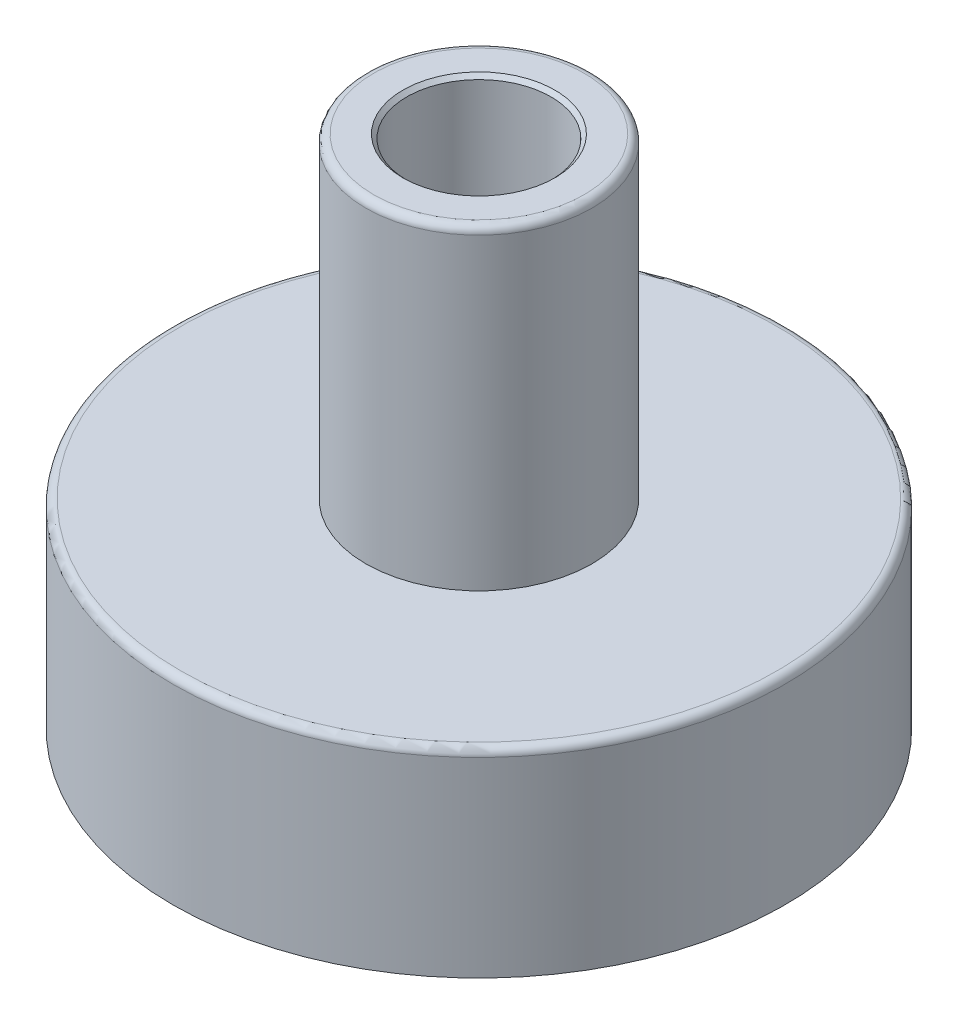
ISO-10303-21;
HEADER;
FILE_DESCRIPTION(('STEP AP214'),'2;1');
FILE_NAME('part.step','',(''),(''),'','','');
FILE_SCHEMA(('AUTOMOTIVE_DESIGN { 1 0 10303 214 1 1 1 1 }'));
ENDSEC;
DATA;
#1=APPLICATION_CONTEXT('core data for automotive mechanical design processes');
#2=APPLICATION_PROTOCOL_DEFINITION('international standard','automotive_design',2000,#1);
#3=PRODUCT_CONTEXT('',#1,'mechanical');
#4=PRODUCT('Part','Part','',(#3));
#5=PRODUCT_RELATED_PRODUCT_CATEGORY('part','',(#4));
#6=PRODUCT_DEFINITION_FORMATION('','',#4);
#7=PRODUCT_DEFINITION_CONTEXT('part definition',#1,'design');
#8=PRODUCT_DEFINITION('design','',#6,#7);
#9=PRODUCT_DEFINITION_SHAPE('','',#8);
#10=(LENGTH_UNIT() NAMED_UNIT(*) SI_UNIT(.MILLI.,.METRE.));
#11=(NAMED_UNIT(*) PLANE_ANGLE_UNIT() SI_UNIT($,.RADIAN.));
#12=(NAMED_UNIT(*) SI_UNIT($,.STERADIAN.) SOLID_ANGLE_UNIT());
#13=UNCERTAINTY_MEASURE_WITH_UNIT(LENGTH_MEASURE(1.E-05),#10,'distance_accuracy_value','');
#14=(GEOMETRIC_REPRESENTATION_CONTEXT(3) GLOBAL_UNCERTAINTY_ASSIGNED_CONTEXT((#13)) GLOBAL_UNIT_ASSIGNED_CONTEXT((#10,
#11,#12)) REPRESENTATION_CONTEXT('',''));
#15=CARTESIAN_POINT('',(0.,0.,0.));
#16=DIRECTION('',(0.,0.,1.));
#17=DIRECTION('',(1.,0.,0.));
#18=AXIS2_PLACEMENT_3D('',#15,#16,#17);
#19=CARTESIAN_POINT('',(0.,-5.1,0.));
#20=DIRECTION('',(0.,1.,0.));
#21=DIRECTION('',(0.,0.,1.));
#22=AXIS2_PLACEMENT_3D('',#19,#20,#21);
#23=CYLINDRICAL_SURFACE('',#22,7.85);
#24=CARTESIAN_POINT('',(0.,-0.2,0.));
#25=DIRECTION('',(0.,1.,0.));
#26=DIRECTION('',(0.,0.,1.));
#27=AXIS2_PLACEMENT_3D('',#24,#25,#26);
#28=CIRCLE('',#27,7.85);
#29=CARTESIAN_POINT('',(0.,-0.2,7.85));
#30=VERTEX_POINT('',#29);
#31=EDGE_CURVE('E10',#30,#30,#28,.F.);
#32=ORIENTED_EDGE('',*,*,#31,.T.);
#33=EDGE_LOOP('',(#32));
#34=FACE_BOUND('',#33,.T.);
#35=CARTESIAN_POINT('',(0.,-5.1,0.));
#36=DIRECTION('',(0.,1.,0.));
#37=DIRECTION('',(0.,0.,1.));
#38=AXIS2_PLACEMENT_3D('',#35,#36,#37);
#39=CIRCLE('',#38,7.85);
#40=CARTESIAN_POINT('',(0.,-5.1,7.85));
#41=VERTEX_POINT('',#40);
#42=EDGE_CURVE('E72',#41,#41,#39,.T.);
#43=ORIENTED_EDGE('',*,*,#42,.T.);
#44=EDGE_LOOP('',(#43));
#45=FACE_BOUND('',#44,.T.);
#46=ADVANCED_FACE('F39',(#34,#45),#23,.T.);
#47=CARTESIAN_POINT('',(0.,-5.1,0.));
#48=DIRECTION('',(0.,1.,0.));
#49=DIRECTION('',(0.,0.,1.));
#50=AXIS2_PLACEMENT_3D('',#47,#48,#49);
#51=PLANE('',#50);
#52=CARTESIAN_POINT('',(0.,-5.1,0.));
#53=DIRECTION('',(0.,-1.,0.));
#54=DIRECTION('',(0.,0.,-1.));
#55=AXIS2_PLACEMENT_3D('',#52,#53,#54);
#56=CIRCLE('',#55,6.25);
#57=CARTESIAN_POINT('',(0.,-5.1,-6.25));
#58=VERTEX_POINT('',#57);
#59=EDGE_CURVE('E84',#58,#58,#56,.T.);
#60=ORIENTED_EDGE('',*,*,#59,.F.);
#61=EDGE_LOOP('',(#60));
#62=FACE_BOUND('',#61,.T.);
#63=ORIENTED_EDGE('',*,*,#42,.F.);
#64=EDGE_LOOP('',(#63));
#65=FACE_BOUND('',#64,.T.);
#66=ADVANCED_FACE('F115',(#62,#65),#51,.F.);
#67=CARTESIAN_POINT('',(0.,0.,0.));
#68=DIRECTION('',(0.,1.,0.));
#69=DIRECTION('',(0.,0.,1.));
#70=AXIS2_PLACEMENT_3D('',#67,#68,#69);
#71=PLANE('',#70);
#72=CARTESIAN_POINT('',(0.,0.,0.));
#73=DIRECTION('',(0.,1.,0.));
#74=DIRECTION('',(0.,0.,1.));
#75=AXIS2_PLACEMENT_3D('',#72,#73,#74);
#76=CIRCLE('',#75,7.65);
#77=CARTESIAN_POINT('',(0.,0.,7.65));
#78=VERTEX_POINT('',#77);
#79=EDGE_CURVE('E47',#78,#78,#76,.T.);
#80=ORIENTED_EDGE('',*,*,#79,.T.);
#81=EDGE_LOOP('',(#80));
#82=FACE_BOUND('',#81,.T.);
#83=CARTESIAN_POINT('',(0.,0.,0.));
#84=DIRECTION('',(0.,1.,0.));
#85=DIRECTION('',(0.,0.,1.));
#86=AXIS2_PLACEMENT_3D('',#83,#84,#85);
#87=CIRCLE('',#86,2.9);
#88=CARTESIAN_POINT('',(0.,0.,2.9));
#89=VERTEX_POINT('',#88);
#90=EDGE_CURVE('E71',#89,#89,#87,.T.);
#91=ORIENTED_EDGE('',*,*,#90,.F.);
#92=EDGE_LOOP('',(#91));
#93=FACE_BOUND('',#92,.T.);
#94=ADVANCED_FACE('F118',(#82,#93),#71,.T.);
#95=CARTESIAN_POINT('',(0.,8.1,0.));
#96=DIRECTION('',(0.,-1.,0.));
#97=DIRECTION('',(0.,0.,-1.));
#98=AXIS2_PLACEMENT_3D('',#95,#96,#97);
#99=CYLINDRICAL_SURFACE('',#98,2.9);
#100=CARTESIAN_POINT('',(0.,7.9,0.));
#101=DIRECTION('',(0.,1.,0.));
#102=DIRECTION('',(0.,0.,1.));
#103=AXIS2_PLACEMENT_3D('',#100,#101,#102);
#104=CIRCLE('',#103,2.9);
#105=CARTESIAN_POINT('',(0.,7.9,2.9));
#106=VERTEX_POINT('',#105);
#107=EDGE_CURVE('E52',#106,#106,#104,.F.);
#108=ORIENTED_EDGE('',*,*,#107,.T.);
#109=EDGE_LOOP('',(#108));
#110=FACE_BOUND('',#109,.T.);
#111=ORIENTED_EDGE('',*,*,#90,.T.);
#112=EDGE_LOOP('',(#111));
#113=FACE_BOUND('',#112,.T.);
#114=ADVANCED_FACE('F151',(#110,#113),#99,.T.);
#115=CARTESIAN_POINT('',(0.,8.1,0.));
#116=DIRECTION('',(0.,1.,0.));
#117=DIRECTION('',(0.,0.,1.));
#118=AXIS2_PLACEMENT_3D('',#115,#116,#117);
#119=PLANE('',#118);
#120=CARTESIAN_POINT('',(0.,8.1,0.));
#121=DIRECTION('',(0.,1.,0.));
#122=DIRECTION('',(0.,0.,1.));
#123=AXIS2_PLACEMENT_3D('',#120,#121,#122);
#124=CIRCLE('',#123,2.7);
#125=CARTESIAN_POINT('',(0.,8.1,2.7));
#126=VERTEX_POINT('',#125);
#127=EDGE_CURVE('E57',#126,#126,#124,.T.);
#128=ORIENTED_EDGE('',*,*,#127,.T.);
#129=EDGE_LOOP('',(#128));
#130=FACE_BOUND('',#129,.T.);
#131=CARTESIAN_POINT('',(0.,8.1,0.));
#132=DIRECTION('',(0.,1.,0.));
#133=DIRECTION('',(0.,0.,1.));
#134=AXIS2_PLACEMENT_3D('',#131,#132,#133);
#135=CIRCLE('',#134,1.95);
#136=CARTESIAN_POINT('',(0.,8.1,1.95));
#137=VERTEX_POINT('',#136);
#138=EDGE_CURVE('E63',#137,#137,#135,.F.);
#139=ORIENTED_EDGE('',*,*,#138,.T.);
#140=EDGE_LOOP('',(#139));
#141=FACE_BOUND('',#140,.T.);
#142=ADVANCED_FACE('F147',(#130,#141),#119,.T.);
#143=CARTESIAN_POINT('',(0.,1.1,0.));
#144=DIRECTION('',(0.,1.,0.));
#145=DIRECTION('',(0.,0.,1.));
#146=AXIS2_PLACEMENT_3D('',#143,#144,#145);
#147=CYLINDRICAL_SURFACE('',#146,1.85);
#148=CARTESIAN_POINT('',(0.,8.,0.));
#149=DIRECTION('',(0.,1.,0.));
#150=DIRECTION('',(0.,0.,1.));
#151=AXIS2_PLACEMENT_3D('',#148,#149,#150);
#152=CIRCLE('',#151,1.85);
#153=CARTESIAN_POINT('',(0.,8.,1.85));
#154=VERTEX_POINT('',#153);
#155=EDGE_CURVE('E67',#154,#154,#152,.T.);
#156=ORIENTED_EDGE('',*,*,#155,.T.);
#157=EDGE_LOOP('',(#156));
#158=FACE_BOUND('',#157,.T.);
#159=CARTESIAN_POINT('',(0.,1.1,0.));
#160=DIRECTION('',(0.,1.,0.));
#161=DIRECTION('',(0.,0.,1.));
#162=AXIS2_PLACEMENT_3D('',#159,#160,#161);
#163=CIRCLE('',#162,1.85);
#164=CARTESIAN_POINT('',(0.,1.1,1.85));
#165=VERTEX_POINT('',#164);
#166=EDGE_CURVE('E76',#165,#165,#163,.T.);
#167=ORIENTED_EDGE('',*,*,#166,.F.);
#168=EDGE_LOOP('',(#167));
#169=FACE_BOUND('',#168,.T.);
#170=ADVANCED_FACE('F150',(#158,#169),#147,.F.);
#171=CARTESIAN_POINT('',(0.,1.1,0.));
#172=DIRECTION('',(0.,1.,0.));
#173=DIRECTION('',(0.,0.,1.));
#174=AXIS2_PLACEMENT_3D('',#171,#172,#173);
#175=PLANE('',#174);
#176=ORIENTED_EDGE('',*,*,#166,.T.);
#177=EDGE_LOOP('',(#176));
#178=FACE_BOUND('',#177,.T.);
#179=ADVANCED_FACE('F135',(#178),#175,.T.);
#180=CARTESIAN_POINT('',(0.,8.,0.));
#181=DIRECTION('',(0.,1.,0.));
#182=DIRECTION('',(0.,0.,1.));
#183=AXIS2_PLACEMENT_3D('',#180,#181,#182);
#184=CONICAL_SURFACE('',#183,1.85,0.785398163397444);
#185=ORIENTED_EDGE('',*,*,#138,.F.);
#186=EDGE_LOOP('',(#185));
#187=FACE_BOUND('',#186,.T.);
#188=ORIENTED_EDGE('',*,*,#155,.F.);
#189=EDGE_LOOP('',(#188));
#190=FACE_BOUND('',#189,.T.);
#191=ADVANCED_FACE('F130',(#187,#190),#184,.F.);
#192=CARTESIAN_POINT('',(0.,7.9,0.));
#193=DIRECTION('',(0.,1.,0.));
#194=DIRECTION('',(0.,0.,1.));
#195=AXIS2_PLACEMENT_3D('',#192,#193,#194);
#196=TOROIDAL_SURFACE('',#195,2.7,0.2);
#197=ORIENTED_EDGE('',*,*,#107,.F.);
#198=EDGE_LOOP('',(#197));
#199=FACE_BOUND('',#198,.T.);
#200=ORIENTED_EDGE('',*,*,#127,.F.);
#201=EDGE_LOOP('',(#200));
#202=FACE_BOUND('',#201,.T.);
#203=ADVANCED_FACE('F134',(#199,#202),#196,.T.);
#204=CARTESIAN_POINT('',(0.,-0.2,0.));
#205=DIRECTION('',(0.,1.,0.));
#206=DIRECTION('',(0.,0.,1.));
#207=AXIS2_PLACEMENT_3D('',#204,#205,#206);
#208=TOROIDAL_SURFACE('',#207,7.65,0.2);
#209=ORIENTED_EDGE('',*,*,#31,.F.);
#210=EDGE_LOOP('',(#209));
#211=FACE_BOUND('',#210,.T.);
#212=ORIENTED_EDGE('',*,*,#79,.F.);
#213=EDGE_LOOP('',(#212));
#214=FACE_BOUND('',#213,.T.);
#215=ADVANCED_FACE('F41',(#211,#214),#208,.T.);
#216=CARTESIAN_POINT('',(0.,-4.85,0.));
#217=DIRECTION('',(0.,-1.,0.));
#218=DIRECTION('',(0.,0.,-1.));
#219=AXIS2_PLACEMENT_3D('',#216,#217,#218);
#220=CYLINDRICAL_SURFACE('',#219,6.25);
#221=CARTESIAN_POINT('',(0.,-4.85,0.));
#222=DIRECTION('',(0.,-1.,0.));
#223=DIRECTION('',(0.,0.,-1.));
#224=AXIS2_PLACEMENT_3D('',#221,#222,#223);
#225=CIRCLE('',#224,6.25);
#226=CARTESIAN_POINT('',(0.,-4.85,-6.25));
#227=VERTEX_POINT('',#226);
#228=EDGE_CURVE('E83',#227,#227,#225,.T.);
#229=ORIENTED_EDGE('',*,*,#228,.F.);
#230=EDGE_LOOP('',(#229));
#231=FACE_BOUND('',#230,.T.);
#232=ORIENTED_EDGE('',*,*,#59,.T.);
#233=EDGE_LOOP('',(#232));
#234=FACE_BOUND('',#233,.T.);
#235=ADVANCED_FACE('F106',(#231,#234),#220,.F.);
#236=CARTESIAN_POINT('',(0.,-4.85,0.));
#237=DIRECTION('',(0.,-1.,0.));
#238=DIRECTION('',(0.,0.,-1.));
#239=AXIS2_PLACEMENT_3D('',#236,#237,#238);
#240=PLANE('',#239);
#241=CARTESIAN_POINT('',(0.,-4.85,0.));
#242=DIRECTION('',(0.,-1.,0.));
#243=DIRECTION('',(0.,0.,-1.));
#244=AXIS2_PLACEMENT_3D('',#241,#242,#243);
#245=CIRCLE('',#244,6.);
#246=CARTESIAN_POINT('',(0.,-4.85,-6.));
#247=VERTEX_POINT('',#246);
#248=EDGE_CURVE('E88',#247,#247,#245,.T.);
#249=ORIENTED_EDGE('',*,*,#248,.F.);
#250=EDGE_LOOP('',(#249));
#251=FACE_BOUND('',#250,.T.);
#252=ORIENTED_EDGE('',*,*,#228,.T.);
#253=EDGE_LOOP('',(#252));
#254=FACE_BOUND('',#253,.T.);
#255=ADVANCED_FACE('F103',(#251,#254),#240,.T.);
#256=CARTESIAN_POINT('',(0.,-4.85,0.));
#257=DIRECTION('',(0.,-1.,0.));
#258=DIRECTION('',(0.,0.,-1.));
#259=AXIS2_PLACEMENT_3D('',#256,#257,#258);
#260=CYLINDRICAL_SURFACE('',#259,6.);
#261=ORIENTED_EDGE('',*,*,#248,.T.);
#262=EDGE_LOOP('',(#261));
#263=FACE_BOUND('',#262,.T.);
#264=CARTESIAN_POINT('',(0.,-5.1,0.));
#265=DIRECTION('',(0.,-1.,0.));
#266=DIRECTION('',(0.,0.,-1.));
#267=AXIS2_PLACEMENT_3D('',#264,#265,#266);
#268=CIRCLE('',#267,6.);
#269=CARTESIAN_POINT('',(0.,-5.1,-6.));
#270=VERTEX_POINT('',#269);
#271=EDGE_CURVE('E92',#270,#270,#268,.T.);
#272=ORIENTED_EDGE('',*,*,#271,.F.);
#273=EDGE_LOOP('',(#272));
#274=FACE_BOUND('',#273,.T.);
#275=ADVANCED_FACE('F100',(#263,#274),#260,.T.);
#276=ORIENTED_EDGE('',*,*,#271,.T.);
#277=EDGE_LOOP('',(#276));
#278=FACE_BOUND('',#277,.T.);
#279=ADVANCED_FACE('F120',(#278),#51,.F.);
#280=CLOSED_SHELL('',(#46,#66,#94,#114,#142,#170,#179,#191,#203,#215,#235,#255,#275,#279));
#281=MANIFOLD_SOLID_BREP('B2',#280);
#282=ADVANCED_BREP_SHAPE_REPRESENTATION('',(#18,#281),#14);
#283=SHAPE_DEFINITION_REPRESENTATION(#9,#282);
ENDSEC;
END-ISO-10303-21;
